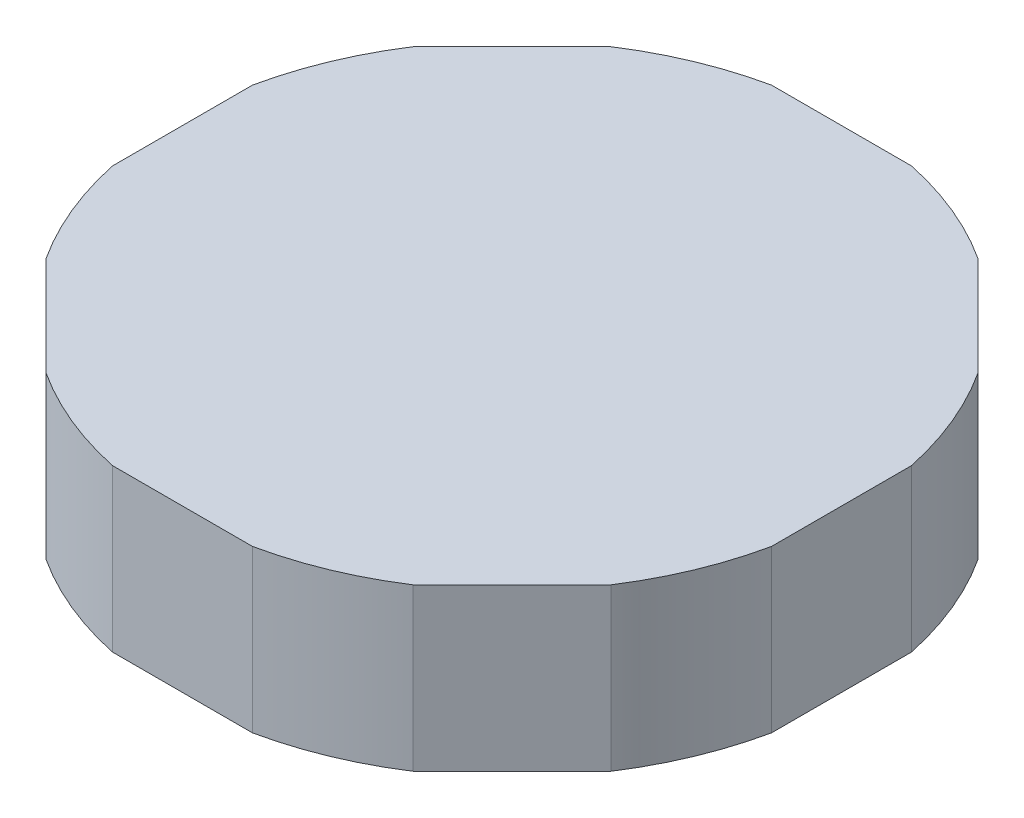
ISO-10303-21;
HEADER;
FILE_DESCRIPTION(('STEP AP214'),'2;1');
FILE_NAME('part.step','',(''),(''),'','','');
FILE_SCHEMA(('AUTOMOTIVE_DESIGN { 1 0 10303 214 1 1 1 1 }'));
ENDSEC;
DATA;
#1=APPLICATION_CONTEXT('core data for automotive mechanical design processes');
#2=APPLICATION_PROTOCOL_DEFINITION('international standard','automotive_design',2000,#1);
#3=PRODUCT_CONTEXT('',#1,'mechanical');
#4=PRODUCT('Part','Part','',(#3));
#5=PRODUCT_RELATED_PRODUCT_CATEGORY('part','',(#4));
#6=PRODUCT_DEFINITION_FORMATION('','',#4);
#7=PRODUCT_DEFINITION_CONTEXT('part definition',#1,'design');
#8=PRODUCT_DEFINITION('design','',#6,#7);
#9=PRODUCT_DEFINITION_SHAPE('','',#8);
#10=(LENGTH_UNIT() NAMED_UNIT(*) SI_UNIT(.MILLI.,.METRE.));
#11=(NAMED_UNIT(*) PLANE_ANGLE_UNIT() SI_UNIT($,.RADIAN.));
#12=(NAMED_UNIT(*) SI_UNIT($,.STERADIAN.) SOLID_ANGLE_UNIT());
#13=UNCERTAINTY_MEASURE_WITH_UNIT(LENGTH_MEASURE(1.E-05),#10,'distance_accuracy_value','');
#14=(GEOMETRIC_REPRESENTATION_CONTEXT(3) GLOBAL_UNCERTAINTY_ASSIGNED_CONTEXT((#13)) GLOBAL_UNIT_ASSIGNED_CONTEXT((#10,
#11,#12)) REPRESENTATION_CONTEXT('',''));
#15=CARTESIAN_POINT('',(0.,0.,0.));
#16=DIRECTION('',(0.,0.,1.));
#17=DIRECTION('',(1.,0.,0.));
#18=AXIS2_PLACEMENT_3D('',#15,#16,#17);
#19=CARTESIAN_POINT('',(0.,3.,0.));
#20=DIRECTION('',(0.,-1.,0.));
#21=DIRECTION('',(0.,0.,-1.));
#22=AXIS2_PLACEMENT_3D('',#19,#20,#21);
#23=CYLINDRICAL_SURFACE('',#22,6.2578401025016);
#24=DIRECTION('',(0.,-1.,0.));
#25=VECTOR('',#24,1.);
#26=CARTESIAN_POINT('',(3.40918830920368,3.,5.2476659402887));
#27=LINE('',#26,#25);
#28=CARTESIAN_POINT('',(3.40918830920368,3.,5.24766594028871));
#29=VERTEX_POINT('',#28);
#30=CARTESIAN_POINT('',(3.40918830920368,0.,5.24766594028871));
#31=VERTEX_POINT('',#30);
#32=EDGE_CURVE('E178',#29,#31,#27,.T.);
#33=ORIENTED_EDGE('',*,*,#32,.F.);
#34=CARTESIAN_POINT('',(0.,3.,0.));
#35=DIRECTION('',(0.,1.,0.));
#36=DIRECTION('',(0.,0.,1.));
#37=AXIS2_PLACEMENT_3D('',#34,#35,#36);
#38=CIRCLE('',#37,6.2578401025016);
#39=CARTESIAN_POINT('',(1.29999999999999,3.,6.12132034355965));
#40=VERTEX_POINT('',#39);
#41=EDGE_CURVE('E170',#40,#29,#38,.T.);
#42=ORIENTED_EDGE('',*,*,#41,.F.);
#43=DIRECTION('',(0.,-1.,0.));
#44=VECTOR('',#43,1.);
#45=CARTESIAN_POINT('',(1.29999999999999,3.,6.12132034355965));
#46=LINE('',#45,#44);
#47=CARTESIAN_POINT('',(1.29999999999999,0.,6.12132034355965));
#48=VERTEX_POINT('',#47);
#49=EDGE_CURVE('E196',#48,#40,#46,.F.);
#50=ORIENTED_EDGE('',*,*,#49,.F.);
#51=CARTESIAN_POINT('',(0.,0.,0.));
#52=DIRECTION('',(0.,1.,0.));
#53=DIRECTION('',(0.,0.,1.));
#54=AXIS2_PLACEMENT_3D('',#51,#52,#53);
#55=CIRCLE('',#54,6.2578401025016);
#56=EDGE_CURVE('E180',#48,#31,#55,.T.);
#57=ORIENTED_EDGE('',*,*,#56,.T.);
#58=EDGE_LOOP('',(#33,#42,#50,#57));
#59=FACE_BOUND('',#58,.T.);
#60=ADVANCED_FACE('F33',(#59),#23,.T.);
#61=DIRECTION('',(0.,-1.,0.));
#62=VECTOR('',#61,1.);
#63=CARTESIAN_POINT('',(5.24766594028871,3.,3.40918830920368));
#64=LINE('',#63,#62);
#65=CARTESIAN_POINT('',(5.24766594028871,0.,3.40918830920368));
#66=VERTEX_POINT('',#65);
#67=CARTESIAN_POINT('',(5.24766594028871,3.,3.40918830920368));
#68=VERTEX_POINT('',#67);
#69=EDGE_CURVE('E210',#66,#68,#64,.F.);
#70=ORIENTED_EDGE('',*,*,#69,.F.);
#71=CARTESIAN_POINT('',(6.12132034355965,0.,1.3));
#72=VERTEX_POINT('',#71);
#73=EDGE_CURVE('E164',#66,#72,#55,.T.);
#74=ORIENTED_EDGE('',*,*,#73,.T.);
#75=DIRECTION('',(0.,-1.,0.));
#76=VECTOR('',#75,1.);
#77=CARTESIAN_POINT('',(6.12132034355965,3.,1.3));
#78=LINE('',#77,#76);
#79=CARTESIAN_POINT('',(6.12132034355965,3.,1.3));
#80=VERTEX_POINT('',#79);
#81=EDGE_CURVE('E146',#80,#72,#78,.T.);
#82=ORIENTED_EDGE('',*,*,#81,.F.);
#83=EDGE_CURVE('E162',#68,#80,#38,.T.);
#84=ORIENTED_EDGE('',*,*,#83,.F.);
#85=EDGE_LOOP('',(#70,#74,#82,#84));
#86=FACE_BOUND('',#85,.T.);
#87=ADVANCED_FACE('F161',(#86),#23,.T.);
#88=DIRECTION('',(0.,-1.,0.));
#89=VECTOR('',#88,1.);
#90=CARTESIAN_POINT('',(-1.29999999999999,3.,6.12132034355965));
#91=LINE('',#90,#89);
#92=CARTESIAN_POINT('',(-1.29999999999999,3.,6.12132034355965));
#93=VERTEX_POINT('',#92);
#94=CARTESIAN_POINT('',(-1.29999999999999,0.,6.12132034355965));
#95=VERTEX_POINT('',#94);
#96=EDGE_CURVE('E47',#93,#95,#91,.T.);
#97=ORIENTED_EDGE('',*,*,#96,.F.);
#98=CARTESIAN_POINT('',(-3.40918830920369,3.,5.2476659402887));
#99=VERTEX_POINT('',#98);
#100=EDGE_CURVE('E174',#99,#93,#38,.T.);
#101=ORIENTED_EDGE('',*,*,#100,.F.);
#102=DIRECTION('',(0.,-1.,0.));
#103=VECTOR('',#102,1.);
#104=CARTESIAN_POINT('',(-3.40918830920369,3.,5.2476659402887));
#105=LINE('',#104,#103);
#106=CARTESIAN_POINT('',(-3.40918830920369,0.,5.2476659402887));
#107=VERTEX_POINT('',#106);
#108=EDGE_CURVE('E214',#107,#99,#105,.F.);
#109=ORIENTED_EDGE('',*,*,#108,.F.);
#110=EDGE_CURVE('E183',#107,#95,#55,.T.);
#111=ORIENTED_EDGE('',*,*,#110,.T.);
#112=EDGE_LOOP('',(#97,#101,#109,#111));
#113=FACE_BOUND('',#112,.T.);
#114=ADVANCED_FACE('F271',(#113),#23,.T.);
#115=DIRECTION('',(0.,-1.,0.));
#116=VECTOR('',#115,1.);
#117=CARTESIAN_POINT('',(-5.2476659402887,3.,3.40918830920369));
#118=LINE('',#117,#116);
#119=CARTESIAN_POINT('',(-5.2476659402887,3.,3.40918830920369));
#120=VERTEX_POINT('',#119);
#121=CARTESIAN_POINT('',(-5.2476659402887,0.,3.40918830920369));
#122=VERTEX_POINT('',#121);
#123=EDGE_CURVE('E55',#120,#122,#118,.T.);
#124=ORIENTED_EDGE('',*,*,#123,.F.);
#125=CARTESIAN_POINT('',(-6.12132034355965,3.,1.29999999999999));
#126=VERTEX_POINT('',#125);
#127=EDGE_CURVE('E263',#126,#120,#38,.T.);
#128=ORIENTED_EDGE('',*,*,#127,.F.);
#129=DIRECTION('',(0.,-1.,0.));
#130=VECTOR('',#129,1.);
#131=CARTESIAN_POINT('',(-6.12132034355965,3.,1.29999999999999));
#132=LINE('',#131,#130);
#133=CARTESIAN_POINT('',(-6.12132034355965,0.,1.29999999999999));
#134=VERTEX_POINT('',#133);
#135=EDGE_CURVE('E218',#134,#126,#132,.F.);
#136=ORIENTED_EDGE('',*,*,#135,.F.);
#137=EDGE_CURVE('E272',#134,#122,#55,.T.);
#138=ORIENTED_EDGE('',*,*,#137,.T.);
#139=EDGE_LOOP('',(#124,#128,#136,#138));
#140=FACE_BOUND('',#139,.T.);
#141=ADVANCED_FACE('F327',(#140),#23,.T.);
#142=DIRECTION('',(0.,-1.,0.));
#143=VECTOR('',#142,1.);
#144=CARTESIAN_POINT('',(-6.12132034355965,3.,-1.29999999999999));
#145=LINE('',#144,#143);
#146=CARTESIAN_POINT('',(-6.12132034355965,3.,-1.29999999999999));
#147=VERTEX_POINT('',#146);
#148=CARTESIAN_POINT('',(-6.12132034355965,0.,-1.29999999999999));
#149=VERTEX_POINT('',#148);
#150=EDGE_CURVE('E216',#147,#149,#145,.T.);
#151=ORIENTED_EDGE('',*,*,#150,.F.);
#152=CARTESIAN_POINT('',(-5.2476659402887,3.,-3.40918830920368));
#153=VERTEX_POINT('',#152);
#154=EDGE_CURVE('E260',#153,#147,#38,.T.);
#155=ORIENTED_EDGE('',*,*,#154,.F.);
#156=DIRECTION('',(0.,-1.,0.));
#157=VECTOR('',#156,1.);
#158=CARTESIAN_POINT('',(-5.24766594028871,3.,-3.40918830920368));
#159=LINE('',#158,#157);
#160=CARTESIAN_POINT('',(-5.2476659402887,0.,-3.40918830920368));
#161=VERTEX_POINT('',#160);
#162=EDGE_CURVE('E222',#161,#153,#159,.F.);
#163=ORIENTED_EDGE('',*,*,#162,.F.);
#164=EDGE_CURVE('E274',#161,#149,#55,.T.);
#165=ORIENTED_EDGE('',*,*,#164,.T.);
#166=EDGE_LOOP('',(#151,#155,#163,#165));
#167=FACE_BOUND('',#166,.T.);
#168=ADVANCED_FACE('F323',(#167),#23,.T.);
#169=DIRECTION('',(0.,-1.,0.));
#170=VECTOR('',#169,1.);
#171=CARTESIAN_POINT('',(-3.40918830920368,3.,-5.2476659402887));
#172=LINE('',#171,#170);
#173=CARTESIAN_POINT('',(-3.40918830920368,3.,-5.2476659402887));
#174=VERTEX_POINT('',#173);
#175=CARTESIAN_POINT('',(-3.40918830920368,0.,-5.2476659402887));
#176=VERTEX_POINT('',#175);
#177=EDGE_CURVE('E220',#174,#176,#172,.T.);
#178=ORIENTED_EDGE('',*,*,#177,.F.);
#179=CARTESIAN_POINT('',(-1.3,3.,-6.12132034355965));
#180=VERTEX_POINT('',#179);
#181=EDGE_CURVE('E258',#180,#174,#38,.T.);
#182=ORIENTED_EDGE('',*,*,#181,.F.);
#183=DIRECTION('',(0.,-1.,0.));
#184=VECTOR('',#183,1.);
#185=CARTESIAN_POINT('',(-1.3,3.,-6.12132034355965));
#186=LINE('',#185,#184);
#187=CARTESIAN_POINT('',(-1.3,0.,-6.12132034355965));
#188=VERTEX_POINT('',#187);
#189=EDGE_CURVE('E226',#188,#180,#186,.F.);
#190=ORIENTED_EDGE('',*,*,#189,.F.);
#191=EDGE_CURVE('E279',#188,#176,#55,.T.);
#192=ORIENTED_EDGE('',*,*,#191,.T.);
#193=EDGE_LOOP('',(#178,#182,#190,#192));
#194=FACE_BOUND('',#193,.T.);
#195=ADVANCED_FACE('F319',(#194),#23,.T.);
#196=DIRECTION('',(0.,-1.,0.));
#197=VECTOR('',#196,1.);
#198=CARTESIAN_POINT('',(1.3,3.,-6.12132034355965));
#199=LINE('',#198,#197);
#200=CARTESIAN_POINT('',(1.3,3.,-6.12132034355965));
#201=VERTEX_POINT('',#200);
#202=CARTESIAN_POINT('',(1.3,0.,-6.12132034355965));
#203=VERTEX_POINT('',#202);
#204=EDGE_CURVE('E224',#201,#203,#199,.T.);
#205=ORIENTED_EDGE('',*,*,#204,.F.);
#206=CARTESIAN_POINT('',(3.40918830920368,3.,-5.24766594028871));
#207=VERTEX_POINT('',#206);
#208=EDGE_CURVE('E175',#207,#201,#38,.T.);
#209=ORIENTED_EDGE('',*,*,#208,.F.);
#210=DIRECTION('',(0.,-1.,0.));
#211=VECTOR('',#210,1.);
#212=CARTESIAN_POINT('',(3.40918830920367,3.,-5.24766594028871));
#213=LINE('',#212,#211);
#214=CARTESIAN_POINT('',(3.40918830920368,0.,-5.24766594028871));
#215=VERTEX_POINT('',#214);
#216=EDGE_CURVE('E165',#215,#207,#213,.F.);
#217=ORIENTED_EDGE('',*,*,#216,.F.);
#218=EDGE_CURVE('E285',#215,#203,#55,.T.);
#219=ORIENTED_EDGE('',*,*,#218,.T.);
#220=EDGE_LOOP('',(#205,#209,#217,#219));
#221=FACE_BOUND('',#220,.T.);
#222=ADVANCED_FACE('F255',(#221),#23,.T.);
#223=DIRECTION('',(0.,-1.,0.));
#224=VECTOR('',#223,1.);
#225=CARTESIAN_POINT('',(5.24766594028871,3.,-3.40918830920367));
#226=LINE('',#225,#224);
#227=CARTESIAN_POINT('',(5.24766594028871,3.,-3.40918830920368));
#228=VERTEX_POINT('',#227);
#229=CARTESIAN_POINT('',(5.24766594028871,0.,-3.40918830920368));
#230=VERTEX_POINT('',#229);
#231=EDGE_CURVE('E228',#228,#230,#226,.T.);
#232=ORIENTED_EDGE('',*,*,#231,.F.);
#233=CARTESIAN_POINT('',(6.12132034355965,3.,-1.3));
#234=VERTEX_POINT('',#233);
#235=EDGE_CURVE('E171',#234,#228,#38,.T.);
#236=ORIENTED_EDGE('',*,*,#235,.F.);
#237=DIRECTION('',(0.,-1.,0.));
#238=VECTOR('',#237,1.);
#239=CARTESIAN_POINT('',(6.12132034355965,3.,-1.3));
#240=LINE('',#239,#238);
#241=CARTESIAN_POINT('',(6.12132034355965,0.,-1.3));
#242=VERTEX_POINT('',#241);
#243=EDGE_CURVE('E149',#242,#234,#240,.F.);
#244=ORIENTED_EDGE('',*,*,#243,.F.);
#245=EDGE_CURVE('E290',#242,#230,#55,.T.);
#246=ORIENTED_EDGE('',*,*,#245,.T.);
#247=EDGE_LOOP('',(#232,#236,#244,#246));
#248=FACE_BOUND('',#247,.T.);
#249=ADVANCED_FACE('F294',(#248),#23,.T.);
#250=CARTESIAN_POINT('',(0.,3.,0.));
#251=DIRECTION('',(0.,1.,0.));
#252=DIRECTION('',(0.,0.,1.));
#253=AXIS2_PLACEMENT_3D('',#250,#251,#252);
#254=PLANE('',#253);
#255=ORIENTED_EDGE('',*,*,#41,.T.);
#256=DIRECTION('',(0.707106781186547,0.,-0.707106781186548));
#257=VECTOR('',#256,1.);
#258=CARTESIAN_POINT('',(2.53553390593274,3.,6.12132034355965));
#259=LINE('',#258,#257);
#260=EDGE_CURVE('E155',#29,#68,#259,.T.);
#261=ORIENTED_EDGE('',*,*,#260,.T.);
#262=ORIENTED_EDGE('',*,*,#83,.T.);
#263=DIRECTION('',(0.,0.,-1.));
#264=VECTOR('',#263,1.);
#265=CARTESIAN_POINT('',(6.12132034355965,3.,2.53553390593274));
#266=LINE('',#265,#264);
#267=EDGE_CURVE('E143',#80,#234,#266,.T.);
#268=ORIENTED_EDGE('',*,*,#267,.T.);
#269=ORIENTED_EDGE('',*,*,#235,.T.);
#270=DIRECTION('',(-0.707106781186548,0.,-0.707106781186547));
#271=VECTOR('',#270,1.);
#272=CARTESIAN_POINT('',(6.12132034355965,3.,-2.53553390593274));
#273=LINE('',#272,#271);
#274=EDGE_CURVE('E154',#228,#207,#273,.T.);
#275=ORIENTED_EDGE('',*,*,#274,.T.);
#276=ORIENTED_EDGE('',*,*,#208,.T.);
#277=DIRECTION('',(-1.,0.,0.));
#278=VECTOR('',#277,1.);
#279=CARTESIAN_POINT('',(2.53553390593274,3.,-6.12132034355965));
#280=LINE('',#279,#278);
#281=EDGE_CURVE('E243',#201,#180,#280,.T.);
#282=ORIENTED_EDGE('',*,*,#281,.T.);
#283=ORIENTED_EDGE('',*,*,#181,.T.);
#284=DIRECTION('',(-0.707106781186547,0.,0.707106781186548));
#285=VECTOR('',#284,1.);
#286=CARTESIAN_POINT('',(-2.53553390593274,3.,-6.12132034355965));
#287=LINE('',#286,#285);
#288=EDGE_CURVE('E240',#174,#153,#287,.T.);
#289=ORIENTED_EDGE('',*,*,#288,.T.);
#290=ORIENTED_EDGE('',*,*,#154,.T.);
#291=DIRECTION('',(0.,0.,1.));
#292=VECTOR('',#291,1.);
#293=CARTESIAN_POINT('',(-6.12132034355965,3.,-2.53553390593274));
#294=LINE('',#293,#292);
#295=EDGE_CURVE('E237',#147,#126,#294,.T.);
#296=ORIENTED_EDGE('',*,*,#295,.T.);
#297=ORIENTED_EDGE('',*,*,#127,.T.);
#298=DIRECTION('',(0.707106781186548,0.,0.707106781186547));
#299=VECTOR('',#298,1.);
#300=CARTESIAN_POINT('',(-6.12132034355965,3.,2.53553390593274));
#301=LINE('',#300,#299);
#302=EDGE_CURVE('E234',#120,#99,#301,.T.);
#303=ORIENTED_EDGE('',*,*,#302,.T.);
#304=ORIENTED_EDGE('',*,*,#100,.T.);
#305=DIRECTION('',(1.,0.,0.));
#306=VECTOR('',#305,1.);
#307=CARTESIAN_POINT('',(-2.53553390593274,3.,6.12132034355965));
#308=LINE('',#307,#306);
#309=EDGE_CURVE('E232',#93,#40,#308,.T.);
#310=ORIENTED_EDGE('',*,*,#309,.T.);
#311=EDGE_LOOP('',(#255,#261,#262,#268,#269,#275,#276,#282,#283,#289,#290,#296,#297,#303,#304,#310));
#312=FACE_BOUND('',#311,.T.);
#313=ADVANCED_FACE('F169',(#312),#254,.T.);
#314=CARTESIAN_POINT('',(0.,0.,0.));
#315=DIRECTION('',(0.,1.,0.));
#316=DIRECTION('',(0.,0.,1.));
#317=AXIS2_PLACEMENT_3D('',#314,#315,#316);
#318=PLANE('',#317);
#319=DIRECTION('',(0.707106781186547,0.,-0.707106781186548));
#320=VECTOR('',#319,1.);
#321=CARTESIAN_POINT('',(4.32842712474619,0.,4.32842712474619));
#322=LINE('',#321,#320);
#323=EDGE_CURVE('E11',#31,#66,#322,.T.);
#324=ORIENTED_EDGE('',*,*,#323,.F.);
#325=ORIENTED_EDGE('',*,*,#56,.F.);
#326=DIRECTION('',(1.,0.,0.));
#327=VECTOR('',#326,1.);
#328=CARTESIAN_POINT('',(0.,0.,6.12132034355965));
#329=LINE('',#328,#327);
#330=EDGE_CURVE('E40',#95,#48,#329,.T.);
#331=ORIENTED_EDGE('',*,*,#330,.F.);
#332=ORIENTED_EDGE('',*,*,#110,.F.);
#333=DIRECTION('',(0.707106781186548,0.,0.707106781186547));
#334=VECTOR('',#333,1.);
#335=CARTESIAN_POINT('',(-4.32842712474619,0.,4.3284271247462));
#336=LINE('',#335,#334);
#337=EDGE_CURVE('E193',#122,#107,#336,.T.);
#338=ORIENTED_EDGE('',*,*,#337,.F.);
#339=ORIENTED_EDGE('',*,*,#137,.F.);
#340=DIRECTION('',(0.,0.,1.));
#341=VECTOR('',#340,1.);
#342=CARTESIAN_POINT('',(-6.12132034355965,0.,0.));
#343=LINE('',#342,#341);
#344=EDGE_CURVE('E191',#149,#134,#343,.T.);
#345=ORIENTED_EDGE('',*,*,#344,.F.);
#346=ORIENTED_EDGE('',*,*,#164,.F.);
#347=DIRECTION('',(-0.707106781186547,0.,0.707106781186548));
#348=VECTOR('',#347,1.);
#349=CARTESIAN_POINT('',(-4.32842712474619,0.,-4.32842712474619));
#350=LINE('',#349,#348);
#351=EDGE_CURVE('E189',#176,#161,#350,.T.);
#352=ORIENTED_EDGE('',*,*,#351,.F.);
#353=ORIENTED_EDGE('',*,*,#191,.F.);
#354=DIRECTION('',(-1.,0.,0.));
#355=VECTOR('',#354,1.);
#356=CARTESIAN_POINT('',(0.,0.,-6.12132034355965));
#357=LINE('',#356,#355);
#358=EDGE_CURVE('E187',#203,#188,#357,.T.);
#359=ORIENTED_EDGE('',*,*,#358,.F.);
#360=ORIENTED_EDGE('',*,*,#218,.F.);
#361=DIRECTION('',(-0.707106781186548,0.,-0.707106781186547));
#362=VECTOR('',#361,1.);
#363=CARTESIAN_POINT('',(4.32842712474619,0.,-4.32842712474619));
#364=LINE('',#363,#362);
#365=EDGE_CURVE('E185',#230,#215,#364,.T.);
#366=ORIENTED_EDGE('',*,*,#365,.F.);
#367=ORIENTED_EDGE('',*,*,#245,.F.);
#368=DIRECTION('',(0.,0.,-1.));
#369=VECTOR('',#368,1.);
#370=CARTESIAN_POINT('',(6.12132034355965,0.,0.));
#371=LINE('',#370,#369);
#372=EDGE_CURVE('E173',#72,#242,#371,.T.);
#373=ORIENTED_EDGE('',*,*,#372,.F.);
#374=ORIENTED_EDGE('',*,*,#73,.F.);
#375=EDGE_LOOP('',(#324,#325,#331,#332,#338,#339,#345,#346,#352,#353,#359,#360,#366,#367,#373,#374));
#376=FACE_BOUND('',#375,.T.);
#377=ADVANCED_FACE('F207',(#376),#318,.F.);
#378=CARTESIAN_POINT('',(6.12132034355965,0.,2.53553390593274));
#379=DIRECTION('',(1.,0.,0.));
#380=DIRECTION('',(0.,0.,-1.));
#381=AXIS2_PLACEMENT_3D('',#378,#379,#380);
#382=PLANE('',#381);
#383=ORIENTED_EDGE('',*,*,#81,.T.);
#384=ORIENTED_EDGE('',*,*,#372,.T.);
#385=ORIENTED_EDGE('',*,*,#243,.T.);
#386=ORIENTED_EDGE('',*,*,#267,.F.);
#387=EDGE_LOOP('',(#383,#384,#385,#386));
#388=FACE_BOUND('',#387,.T.);
#389=ADVANCED_FACE('F145',(#388),#382,.T.);
#390=CARTESIAN_POINT('',(6.12132034355965,0.,-2.53553390593274));
#391=DIRECTION('',(0.707106781186547,0.,-0.707106781186548));
#392=DIRECTION('',(-0.707106781186548,0.,-0.707106781186547));
#393=AXIS2_PLACEMENT_3D('',#390,#391,#392);
#394=PLANE('',#393);
#395=ORIENTED_EDGE('',*,*,#231,.T.);
#396=ORIENTED_EDGE('',*,*,#365,.T.);
#397=ORIENTED_EDGE('',*,*,#216,.T.);
#398=ORIENTED_EDGE('',*,*,#274,.F.);
#399=EDGE_LOOP('',(#395,#396,#397,#398));
#400=FACE_BOUND('',#399,.T.);
#401=ADVANCED_FACE('F297',(#400),#394,.T.);
#402=CARTESIAN_POINT('',(2.53553390593274,0.,-6.12132034355965));
#403=DIRECTION('',(0.,0.,-1.));
#404=DIRECTION('',(-1.,0.,0.));
#405=AXIS2_PLACEMENT_3D('',#402,#403,#404);
#406=PLANE('',#405);
#407=ORIENTED_EDGE('',*,*,#204,.T.);
#408=ORIENTED_EDGE('',*,*,#358,.T.);
#409=ORIENTED_EDGE('',*,*,#189,.T.);
#410=ORIENTED_EDGE('',*,*,#281,.F.);
#411=EDGE_LOOP('',(#407,#408,#409,#410));
#412=FACE_BOUND('',#411,.T.);
#413=ADVANCED_FACE('F299',(#412),#406,.T.);
#414=CARTESIAN_POINT('',(-2.53553390593274,0.,-6.12132034355965));
#415=DIRECTION('',(-0.707106781186548,0.,-0.707106781186547));
#416=DIRECTION('',(-0.707106781186547,0.,0.707106781186548));
#417=AXIS2_PLACEMENT_3D('',#414,#415,#416);
#418=PLANE('',#417);
#419=ORIENTED_EDGE('',*,*,#177,.T.);
#420=ORIENTED_EDGE('',*,*,#351,.T.);
#421=ORIENTED_EDGE('',*,*,#162,.T.);
#422=ORIENTED_EDGE('',*,*,#288,.F.);
#423=EDGE_LOOP('',(#419,#420,#421,#422));
#424=FACE_BOUND('',#423,.T.);
#425=ADVANCED_FACE('F305',(#424),#418,.T.);
#426=CARTESIAN_POINT('',(-6.12132034355965,0.,-2.53553390593274));
#427=DIRECTION('',(-1.,0.,0.));
#428=DIRECTION('',(0.,0.,1.));
#429=AXIS2_PLACEMENT_3D('',#426,#427,#428);
#430=PLANE('',#429);
#431=ORIENTED_EDGE('',*,*,#150,.T.);
#432=ORIENTED_EDGE('',*,*,#344,.T.);
#433=ORIENTED_EDGE('',*,*,#135,.T.);
#434=ORIENTED_EDGE('',*,*,#295,.F.);
#435=EDGE_LOOP('',(#431,#432,#433,#434));
#436=FACE_BOUND('',#435,.T.);
#437=ADVANCED_FACE('F332',(#436),#430,.T.);
#438=CARTESIAN_POINT('',(-6.12132034355965,0.,2.53553390593274));
#439=DIRECTION('',(-0.707106781186547,0.,0.707106781186548));
#440=DIRECTION('',(0.707106781186548,0.,0.707106781186547));
#441=AXIS2_PLACEMENT_3D('',#438,#439,#440);
#442=PLANE('',#441);
#443=ORIENTED_EDGE('',*,*,#123,.T.);
#444=ORIENTED_EDGE('',*,*,#337,.T.);
#445=ORIENTED_EDGE('',*,*,#108,.T.);
#446=ORIENTED_EDGE('',*,*,#302,.F.);
#447=EDGE_LOOP('',(#443,#444,#445,#446));
#448=FACE_BOUND('',#447,.T.);
#449=ADVANCED_FACE('F379',(#448),#442,.T.);
#450=CARTESIAN_POINT('',(-2.53553390593274,0.,6.12132034355965));
#451=DIRECTION('',(0.,0.,1.));
#452=DIRECTION('',(1.,0.,0.));
#453=AXIS2_PLACEMENT_3D('',#450,#451,#452);
#454=PLANE('',#453);
#455=ORIENTED_EDGE('',*,*,#96,.T.);
#456=ORIENTED_EDGE('',*,*,#330,.T.);
#457=ORIENTED_EDGE('',*,*,#49,.T.);
#458=ORIENTED_EDGE('',*,*,#309,.F.);
#459=EDGE_LOOP('',(#455,#456,#457,#458));
#460=FACE_BOUND('',#459,.T.);
#461=ADVANCED_FACE('F195',(#460),#454,.T.);
#462=CARTESIAN_POINT('',(2.53553390593274,0.,6.12132034355965));
#463=DIRECTION('',(0.707106781186548,0.,0.707106781186547));
#464=DIRECTION('',(0.707106781186547,0.,-0.707106781186548));
#465=AXIS2_PLACEMENT_3D('',#462,#463,#464);
#466=PLANE('',#465);
#467=ORIENTED_EDGE('',*,*,#32,.T.);
#468=ORIENTED_EDGE('',*,*,#323,.T.);
#469=ORIENTED_EDGE('',*,*,#69,.T.);
#470=ORIENTED_EDGE('',*,*,#260,.F.);
#471=EDGE_LOOP('',(#467,#468,#469,#470));
#472=FACE_BOUND('',#471,.T.);
#473=ADVANCED_FACE('F209',(#472),#466,.T.);
#474=CLOSED_SHELL('',(#60,#87,#114,#141,#168,#195,#222,#249,#313,#377,#389,#401,#413,#425,#437,
#449,#461,#473));
#475=MANIFOLD_SOLID_BREP('B2',#474);
#476=ADVANCED_BREP_SHAPE_REPRESENTATION('',(#18,#475),#14);
#477=SHAPE_DEFINITION_REPRESENTATION(#9,#476);
ENDSEC;
END-ISO-10303-21;
